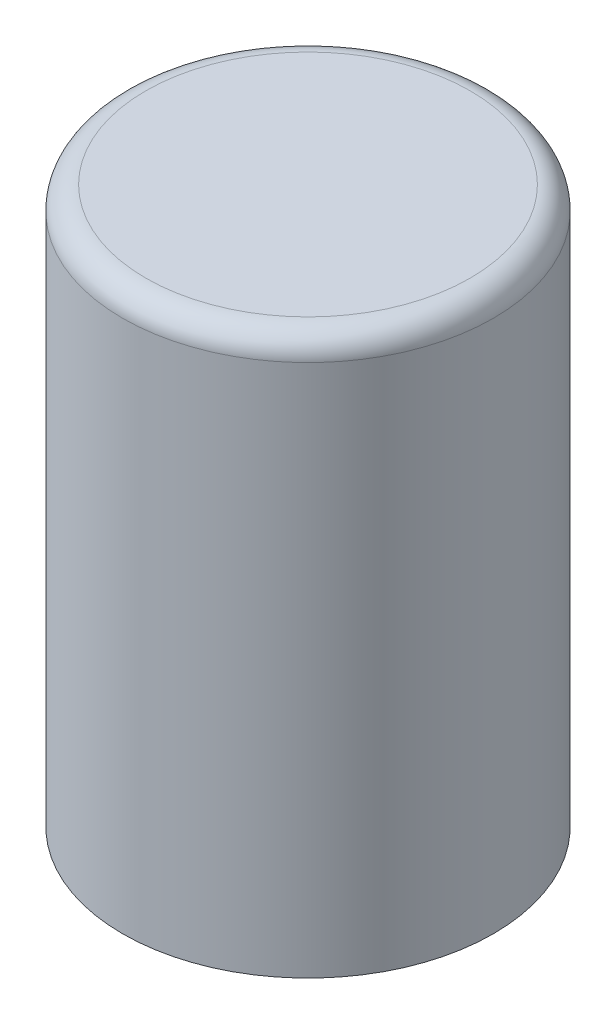
ISO-10303-21;
HEADER;
FILE_DESCRIPTION(('STEP AP214'),'2;1');
FILE_NAME('part.step','',(''),(''),'','','');
FILE_SCHEMA(('AUTOMOTIVE_DESIGN { 1 0 10303 214 1 1 1 1 }'));
ENDSEC;
DATA;
#1=APPLICATION_CONTEXT('core data for automotive mechanical design processes');
#2=APPLICATION_PROTOCOL_DEFINITION('international standard','automotive_design',2000,#1);
#3=PRODUCT_CONTEXT('',#1,'mechanical');
#4=PRODUCT('Part','Part','',(#3));
#5=PRODUCT_RELATED_PRODUCT_CATEGORY('part','',(#4));
#6=PRODUCT_DEFINITION_FORMATION('','',#4);
#7=PRODUCT_DEFINITION_CONTEXT('part definition',#1,'design');
#8=PRODUCT_DEFINITION('design','',#6,#7);
#9=PRODUCT_DEFINITION_SHAPE('','',#8);
#10=(LENGTH_UNIT() NAMED_UNIT(*) SI_UNIT(.MILLI.,.METRE.));
#11=(NAMED_UNIT(*) PLANE_ANGLE_UNIT() SI_UNIT($,.RADIAN.));
#12=(NAMED_UNIT(*) SI_UNIT($,.STERADIAN.) SOLID_ANGLE_UNIT());
#13=UNCERTAINTY_MEASURE_WITH_UNIT(LENGTH_MEASURE(1.E-05),#10,'distance_accuracy_value','');
#14=(GEOMETRIC_REPRESENTATION_CONTEXT(3) GLOBAL_UNCERTAINTY_ASSIGNED_CONTEXT((#13)) GLOBAL_UNIT_ASSIGNED_CONTEXT((#10,
#11,#12)) REPRESENTATION_CONTEXT('',''));
#15=CARTESIAN_POINT('',(0.,0.,0.));
#16=DIRECTION('',(0.,0.,1.));
#17=DIRECTION('',(1.,0.,0.));
#18=AXIS2_PLACEMENT_3D('',#15,#16,#17);
#19=CARTESIAN_POINT('',(0.,6.,0.));
#20=DIRECTION('',(0.,1.,0.));
#21=DIRECTION('',(0.,0.,1.));
#22=AXIS2_PLACEMENT_3D('',#19,#20,#21);
#23=PLANE('',#22);
#24=CARTESIAN_POINT('',(0.,6.,0.));
#25=DIRECTION('',(0.,-1.,0.));
#26=DIRECTION('',(0.,0.,-1.));
#27=AXIS2_PLACEMENT_3D('',#24,#25,#26);
#28=CIRCLE('',#27,1.75);
#29=CARTESIAN_POINT('',(0.,6.,-1.75));
#30=VERTEX_POINT('',#29);
#31=CARTESIAN_POINT('',(0.,6.,1.75));
#32=VERTEX_POINT('',#31);
#33=EDGE_CURVE('E40',#30,#32,#28,.T.);
#34=ORIENTED_EDGE('',*,*,#33,.F.);
#35=CARTESIAN_POINT('',(0.,6.,0.));
#36=DIRECTION('',(0.,-1.,0.));
#37=DIRECTION('',(0.,0.,1.));
#38=AXIS2_PLACEMENT_3D('',#35,#36,#37);
#39=CIRCLE('',#38,1.75);
#40=EDGE_CURVE('E34',#32,#30,#39,.T.);
#41=ORIENTED_EDGE('',*,*,#40,.F.);
#42=EDGE_LOOP('',(#34,#41));
#43=FACE_BOUND('',#42,.T.);
#44=ADVANCED_FACE('F17',(#43),#23,.T.);
#45=CARTESIAN_POINT('',(0.,5.75,0.));
#46=DIRECTION('',(0.,1.,0.));
#47=DIRECTION('',(0.,0.,1.));
#48=AXIS2_PLACEMENT_3D('',#45,#46,#47);
#49=TOROIDAL_SURFACE('',#48,1.75,0.25);
#50=ORIENTED_EDGE('',*,*,#40,.T.);
#51=ORIENTED_EDGE('',*,*,#33,.T.);
#52=EDGE_LOOP('',(#50,#51));
#53=FACE_BOUND('',#52,.T.);
#54=CARTESIAN_POINT('',(0.,5.75,0.));
#55=DIRECTION('',(0.,-1.,0.));
#56=DIRECTION('',(0.,0.,-1.));
#57=AXIS2_PLACEMENT_3D('',#54,#55,#56);
#58=CIRCLE('',#57,2.);
#59=CARTESIAN_POINT('',(0.,5.75,-2.));
#60=VERTEX_POINT('',#59);
#61=EDGE_CURVE('E27',#60,#60,#58,.T.);
#62=ORIENTED_EDGE('',*,*,#61,.F.);
#63=EDGE_LOOP('',(#62));
#64=FACE_BOUND('',#63,.T.);
#65=ADVANCED_FACE('F38',(#53,#64),#49,.T.);
#66=CARTESIAN_POINT('',(0.,0.,0.));
#67=DIRECTION('',(0.,1.,0.));
#68=DIRECTION('',(0.,0.,1.));
#69=AXIS2_PLACEMENT_3D('',#66,#67,#68);
#70=PLANE('',#69);
#71=CARTESIAN_POINT('',(0.,0.,0.));
#72=DIRECTION('',(0.,-1.,0.));
#73=DIRECTION('',(0.,0.,-1.));
#74=AXIS2_PLACEMENT_3D('',#71,#72,#73);
#75=CIRCLE('',#74,2.);
#76=CARTESIAN_POINT('',(0.,0.,-2.));
#77=VERTEX_POINT('',#76);
#78=EDGE_CURVE('E11',#77,#77,#75,.F.);
#79=ORIENTED_EDGE('',*,*,#78,.F.);
#80=EDGE_LOOP('',(#79));
#81=FACE_BOUND('',#80,.T.);
#82=ADVANCED_FACE('F73',(#81),#70,.F.);
#83=CARTESIAN_POINT('',(0.,6.,0.));
#84=DIRECTION('',(0.,-1.,0.));
#85=DIRECTION('',(0.,0.,-1.));
#86=AXIS2_PLACEMENT_3D('',#83,#84,#85);
#87=CYLINDRICAL_SURFACE('',#86,2.);
#88=ORIENTED_EDGE('',*,*,#78,.T.);
#89=EDGE_LOOP('',(#88));
#90=FACE_BOUND('',#89,.T.);
#91=ORIENTED_EDGE('',*,*,#61,.T.);
#92=EDGE_LOOP('',(#91));
#93=FACE_BOUND('',#92,.T.);
#94=ADVANCED_FACE('F77',(#90,#93),#87,.T.);
#95=CLOSED_SHELL('',(#44,#65,#82,#94));
#96=MANIFOLD_SOLID_BREP('B1',#95);
#97=ADVANCED_BREP_SHAPE_REPRESENTATION('',(#18,#96),#14);
#98=SHAPE_DEFINITION_REPRESENTATION(#9,#97);
ENDSEC;
END-ISO-10303-21;
